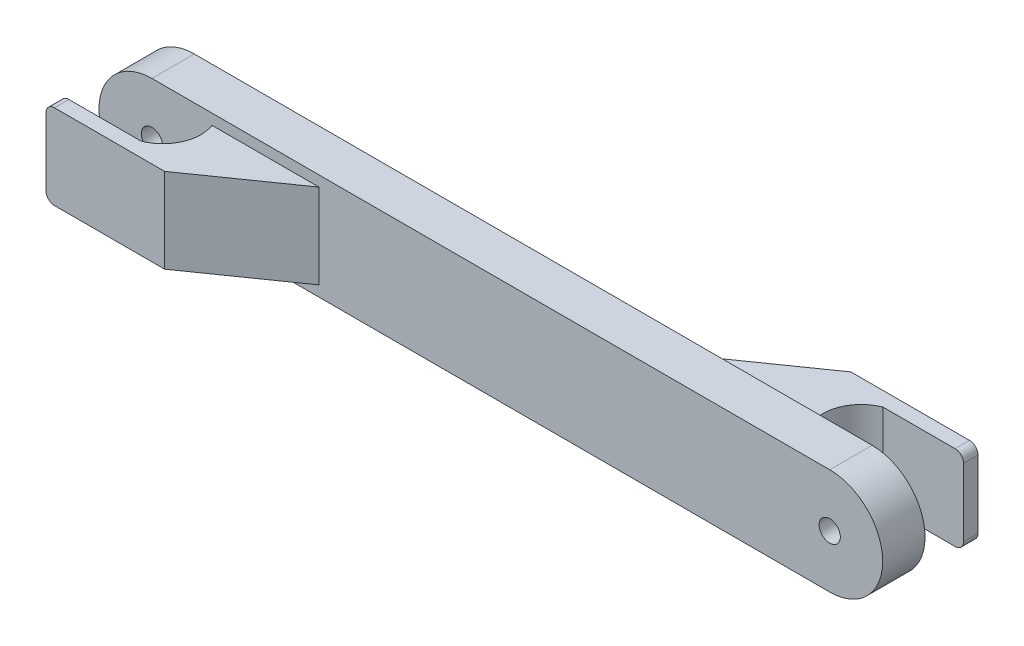
ISO-10303-21;
HEADER;
FILE_DESCRIPTION(('STEP AP214'),'2;1');
FILE_NAME('part.step','',(''),(''),'','','');
FILE_SCHEMA(('AUTOMOTIVE_DESIGN { 1 0 10303 214 1 1 1 1 }'));
ENDSEC;
DATA;
#1=APPLICATION_CONTEXT('core data for automotive mechanical design processes');
#2=APPLICATION_PROTOCOL_DEFINITION('international standard','automotive_design',2000,#1);
#3=PRODUCT_CONTEXT('',#1,'mechanical');
#4=PRODUCT('Part','Part','',(#3));
#5=PRODUCT_RELATED_PRODUCT_CATEGORY('part','',(#4));
#6=PRODUCT_DEFINITION_FORMATION('','',#4);
#7=PRODUCT_DEFINITION_CONTEXT('part definition',#1,'design');
#8=PRODUCT_DEFINITION('design','',#6,#7);
#9=PRODUCT_DEFINITION_SHAPE('','',#8);
#10=(LENGTH_UNIT() NAMED_UNIT(*) SI_UNIT(.MILLI.,.METRE.));
#11=(NAMED_UNIT(*) PLANE_ANGLE_UNIT() SI_UNIT($,.RADIAN.));
#12=(NAMED_UNIT(*) SI_UNIT($,.STERADIAN.) SOLID_ANGLE_UNIT());
#13=UNCERTAINTY_MEASURE_WITH_UNIT(LENGTH_MEASURE(1.E-05),#10,'distance_accuracy_value','');
#14=(GEOMETRIC_REPRESENTATION_CONTEXT(3) GLOBAL_UNCERTAINTY_ASSIGNED_CONTEXT((#13)) GLOBAL_UNIT_ASSIGNED_CONTEXT((#10,
#11,#12)) REPRESENTATION_CONTEXT('',''));
#15=CARTESIAN_POINT('',(0.,0.,0.));
#16=DIRECTION('',(0.,0.,1.));
#17=DIRECTION('',(1.,0.,0.));
#18=AXIS2_PLACEMENT_3D('',#15,#16,#17);
#19=CARTESIAN_POINT('',(299.870251740866,-79.0606144476608,6.35));
#20=DIRECTION('',(0.,0.,1.));
#21=DIRECTION('',(1.,0.,0.));
#22=AXIS2_PLACEMENT_3D('',#19,#20,#21);
#23=PLANE('',#22);
#24=DIRECTION('',(1.,0.,0.));
#25=VECTOR('',#24,1.);
#26=CARTESIAN_POINT('',(513.230251740866,-66.3606144476608,6.35));
#27=LINE('',#26,#25);
#28=CARTESIAN_POINT('',(450.464032212428,-66.3606144476608,6.35));
#29=VERTEX_POINT('',#28);
#30=CARTESIAN_POINT('',(485.036934777947,-66.3606144476608,6.35));
#31=VERTEX_POINT('',#30);
#32=EDGE_CURVE('E12',#29,#31,#27,.T.);
#33=ORIENTED_EDGE('',*,*,#32,.F.);
#34=DIRECTION('',(0.,-1.,0.));
#35=VECTOR('',#34,1.);
#36=CARTESIAN_POINT('',(450.464032212428,-66.3606144476608,6.35));
#37=LINE('',#36,#35);
#38=CARTESIAN_POINT('',(450.464032212428,-91.7606144476608,6.35));
#39=VERTEX_POINT('',#38);
#40=EDGE_CURVE('E101',#29,#39,#37,.T.);
#41=ORIENTED_EDGE('',*,*,#40,.T.);
#42=DIRECTION('',(-1.,0.,0.));
#43=VECTOR('',#42,1.);
#44=CARTESIAN_POINT('',(513.230251740866,-91.7606144476608,6.35));
#45=LINE('',#44,#43);
#46=CARTESIAN_POINT('',(485.036934777947,-91.7606144476608,6.35));
#47=VERTEX_POINT('',#46);
#48=EDGE_CURVE('E68',#47,#39,#45,.T.);
#49=ORIENTED_EDGE('',*,*,#48,.F.);
#50=DIRECTION('',(0.,-1.,0.));
#51=VECTOR('',#50,1.);
#52=CARTESIAN_POINT('',(485.036934777947,-61.2806144476608,6.35));
#53=LINE('',#52,#51);
#54=EDGE_CURVE('E59',#31,#47,#53,.T.);
#55=ORIENTED_EDGE('',*,*,#54,.F.);
#56=EDGE_LOOP('',(#33,#41,#49,#55));
#57=FACE_BOUND('',#56,.T.);
#58=CARTESIAN_POINT('',(299.870251740866,-79.0606144476608,6.35));
#59=DIRECTION('',(0.,0.,1.));
#60=DIRECTION('',(1.,0.,0.));
#61=AXIS2_PLACEMENT_3D('',#58,#59,#60);
#62=CIRCLE('',#61,3.17499999999997);
#63=CARTESIAN_POINT('',(303.045251740866,-79.0606144476608,6.35));
#64=VERTEX_POINT('',#63);
#65=EDGE_CURVE('E97',#64,#64,#62,.F.);
#66=ORIENTED_EDGE('',*,*,#65,.F.);
#67=EDGE_LOOP('',(#66));
#68=FACE_BOUND('',#67,.T.);
#69=CARTESIAN_POINT('',(503.070251740866,-79.0606144476608,6.35));
#70=DIRECTION('',(0.,0.,1.));
#71=DIRECTION('',(1.,0.,0.));
#72=AXIS2_PLACEMENT_3D('',#69,#70,#71);
#73=CIRCLE('',#72,3.17500000000008);
#74=CARTESIAN_POINT('',(506.245251740866,-79.0606144476608,6.35));
#75=VERTEX_POINT('',#74);
#76=EDGE_CURVE('E89',#75,#75,#73,.F.);
#77=ORIENTED_EDGE('',*,*,#76,.F.);
#78=EDGE_LOOP('',(#77));
#79=FACE_BOUND('',#78,.T.);
#80=CARTESIAN_POINT('',(503.070251740866,-79.0606144476608,6.35));
#81=DIRECTION('',(0.,0.,1.));
#82=DIRECTION('',(1.,0.,0.));
#83=AXIS2_PLACEMENT_3D('',#80,#81,#82);
#84=CIRCLE('',#83,15.875);
#85=CARTESIAN_POINT('',(503.070251740866,-63.1856144476608,6.35));
#86=VERTEX_POINT('',#85);
#87=CARTESIAN_POINT('',(503.070251740866,-94.9356144476608,6.35));
#88=VERTEX_POINT('',#87);
#89=EDGE_CURVE('E95',#86,#88,#84,.F.);
#90=ORIENTED_EDGE('',*,*,#89,.T.);
#91=DIRECTION('',(-1.,0.,0.));
#92=VECTOR('',#91,1.);
#93=CARTESIAN_POINT('',(299.870251740866,-94.9356144476608,6.35));
#94=LINE('',#93,#92);
#95=CARTESIAN_POINT('',(299.870251740866,-94.9356144476608,6.35));
#96=VERTEX_POINT('',#95);
#97=EDGE_CURVE('E94',#88,#96,#94,.T.);
#98=ORIENTED_EDGE('',*,*,#97,.T.);
#99=CARTESIAN_POINT('',(299.870251740866,-79.0606144476608,6.35));
#100=DIRECTION('',(0.,0.,1.));
#101=DIRECTION('',(1.,0.,0.));
#102=AXIS2_PLACEMENT_3D('',#99,#100,#101);
#103=CIRCLE('',#102,15.875);
#104=CARTESIAN_POINT('',(299.870251740866,-63.1856144476608,6.35));
#105=VERTEX_POINT('',#104);
#106=EDGE_CURVE('E84',#96,#105,#103,.F.);
#107=ORIENTED_EDGE('',*,*,#106,.T.);
#108=DIRECTION('',(1.,0.,0.));
#109=VECTOR('',#108,1.);
#110=CARTESIAN_POINT('',(299.870251740866,-63.1856144476608,6.35));
#111=LINE('',#110,#109);
#112=EDGE_CURVE('E87',#105,#86,#111,.T.);
#113=ORIENTED_EDGE('',*,*,#112,.T.);
#114=EDGE_LOOP('',(#90,#98,#107,#113));
#115=FACE_BOUND('',#114,.T.);
#116=ADVANCED_FACE('F52',(#57,#68,#79,#115),#23,.F.);
#117=OPEN_SHELL('',(#116));
#118=SHELL_BASED_SURFACE_MODEL('B2',(#117));
#119=CARTESIAN_POINT('',(287.170251740866,-89.2206144476608,31.75));
#120=DIRECTION('',(1.,0.,0.));
#121=DIRECTION('',(0.,0.,-1.));
#122=AXIS2_PLACEMENT_3D('',#119,#120,#121);
#123=PLANE('',#122);
#124=DIRECTION('',(0.,1.,0.));
#125=VECTOR('',#124,1.);
#126=CARTESIAN_POINT('',(287.170251740866,-107.508614447661,27.432));
#127=LINE('',#126,#125);
#128=CARTESIAN_POINT('',(287.170251740866,-89.2206144476609,27.432));
#129=VERTEX_POINT('',#128);
#130=CARTESIAN_POINT('',(287.170251740866,-68.9006144476609,27.432));
#131=VERTEX_POINT('',#130);
#132=EDGE_CURVE('E165',#129,#131,#127,.T.);
#133=ORIENTED_EDGE('',*,*,#132,.F.);
#134=DIRECTION('',(0.,0.,-1.));
#135=VECTOR('',#134,1.);
#136=CARTESIAN_POINT('',(287.170251740866,-89.2206144476608,31.75));
#137=LINE('',#136,#135);
#138=CARTESIAN_POINT('',(287.170251740866,-89.2206144476608,31.75));
#139=VERTEX_POINT('',#138);
#140=EDGE_CURVE('E328',#139,#129,#137,.T.);
#141=ORIENTED_EDGE('',*,*,#140,.F.);
#142=DIRECTION('',(0.,-1.,0.));
#143=VECTOR('',#142,1.);
#144=CARTESIAN_POINT('',(287.170251740866,-89.2206144476608,31.75));
#145=LINE('',#144,#143);
#146=CARTESIAN_POINT('',(287.170251740866,-68.9006144476609,31.75));
#147=VERTEX_POINT('',#146);
#148=EDGE_CURVE('E317',#147,#139,#145,.T.);
#149=ORIENTED_EDGE('',*,*,#148,.F.);
#150=DIRECTION('',(0.,0.,-1.));
#151=VECTOR('',#150,1.);
#152=CARTESIAN_POINT('',(287.170251740866,-68.9006144476609,31.75));
#153=LINE('',#152,#151);
#154=EDGE_CURVE('E331',#147,#131,#153,.T.);
#155=ORIENTED_EDGE('',*,*,#154,.T.);
#156=EDGE_LOOP('',(#133,#141,#149,#155));
#157=FACE_BOUND('',#156,.T.);
#158=ADVANCED_FACE('F149',(#157),#123,.F.);
#159=CARTESIAN_POINT('',(289.710251740866,-66.3606144476609,31.75));
#160=DIRECTION('',(0.,-1.,0.));
#161=DIRECTION('',(0.,0.,-1.));
#162=AXIS2_PLACEMENT_3D('',#159,#160,#161);
#163=PLANE('',#162);
#164=DIRECTION('',(1.,0.,0.));
#165=VECTOR('',#164,1.);
#166=CARTESIAN_POINT('',(287.170251740866,-66.3606144476609,27.432));
#167=LINE('',#166,#165);
#168=CARTESIAN_POINT('',(289.710251740866,-66.3606144476609,27.432));
#169=VERTEX_POINT('',#168);
#170=CARTESIAN_POINT('',(311.300251740866,-66.3606144476609,27.432));
#171=VERTEX_POINT('',#170);
#172=EDGE_CURVE('E157',#169,#171,#167,.T.);
#173=ORIENTED_EDGE('',*,*,#172,.F.);
#174=DIRECTION('',(0.,0.,-1.));
#175=VECTOR('',#174,1.);
#176=CARTESIAN_POINT('',(289.710251740866,-66.3606144476609,31.75));
#177=LINE('',#176,#175);
#178=CARTESIAN_POINT('',(289.710251740866,-66.3606144476609,31.75));
#179=VERTEX_POINT('',#178);
#180=EDGE_CURVE('E333',#179,#169,#177,.T.);
#181=ORIENTED_EDGE('',*,*,#180,.F.);
#182=DIRECTION('',(-1.,0.,0.));
#183=VECTOR('',#182,1.);
#184=CARTESIAN_POINT('',(312.570251740866,-66.3606144476609,31.75));
#185=LINE('',#184,#183);
#186=CARTESIAN_POINT('',(322.730251740866,-66.3606144476609,31.75));
#187=VERTEX_POINT('',#186);
#188=EDGE_CURVE('E321',#187,#179,#185,.T.);
#189=ORIENTED_EDGE('',*,*,#188,.F.);
#190=DIRECTION('',(0.819152044288995,0.,-0.573576436351041));
#191=VECTOR('',#190,1.);
#192=CARTESIAN_POINT('',(322.730251740866,-66.3606144476609,31.75));
#193=LINE('',#192,#191);
#194=CARTESIAN_POINT('',(349.936471269304,-66.3606144476609,12.7));
#195=VERTEX_POINT('',#194);
#196=EDGE_CURVE('E295',#187,#195,#193,.T.);
#197=ORIENTED_EDGE('',*,*,#196,.T.);
#198=DIRECTION('',(-1.,0.,0.));
#199=VECTOR('',#198,1.);
#200=CARTESIAN_POINT('',(289.710251740866,-66.3606144476609,12.7));
#201=LINE('',#200,#199);
#202=CARTESIAN_POINT('',(317.904251740866,-66.3606144476609,12.7));
#203=VERTEX_POINT('',#202);
#204=EDGE_CURVE('E318',#195,#203,#201,.T.);
#205=ORIENTED_EDGE('',*,*,#204,.T.);
#206=CARTESIAN_POINT('',(307.218041577106,-66.3606144476609,16.7558368231421));
#207=DIRECTION('',(0.,1.,0.));
#208=DIRECTION('',(0.,0.,-1.));
#209=AXIS2_PLACEMENT_3D('',#206,#207,#208);
#210=CIRCLE('',#209,11.43);
#211=EDGE_CURVE('E509',#171,#203,#210,.T.);
#212=ORIENTED_EDGE('',*,*,#211,.F.);
#213=EDGE_LOOP('',(#173,#181,#189,#197,#205,#212));
#214=FACE_BOUND('',#213,.T.);
#215=ADVANCED_FACE('F479',(#214),#163,.F.);
#216=CARTESIAN_POINT('',(299.870251740866,-79.0606144476608,0.));
#217=DIRECTION('',(0.,0.,1.));
#218=DIRECTION('',(1.,0.,0.));
#219=AXIS2_PLACEMENT_3D('',#216,#217,#218);
#220=PLANE('',#219);
#221=CARTESIAN_POINT('',(503.070251740866,-79.0606144476608,0.));
#222=DIRECTION('',(0.,0.,1.));
#223=DIRECTION('',(1.,0.,0.));
#224=AXIS2_PLACEMENT_3D('',#221,#222,#223);
#225=CIRCLE('',#224,3.17500000000008);
#226=CARTESIAN_POINT('',(506.245251740866,-79.0606144476608,0.));
#227=VERTEX_POINT('',#226);
#228=EDGE_CURVE('E354',#227,#227,#225,.T.);
#229=ORIENTED_EDGE('',*,*,#228,.T.);
#230=EDGE_LOOP('',(#229));
#231=FACE_BOUND('',#230,.T.);
#232=CARTESIAN_POINT('',(299.870251740866,-79.0606144476608,0.));
#233=DIRECTION('',(0.,0.,1.));
#234=DIRECTION('',(1.,0.,0.));
#235=AXIS2_PLACEMENT_3D('',#232,#233,#234);
#236=CIRCLE('',#235,15.875);
#237=CARTESIAN_POINT('',(299.870251740866,-63.1856144476608,0.));
#238=VERTEX_POINT('',#237);
#239=CARTESIAN_POINT('',(299.870251740866,-94.9356144476608,0.));
#240=VERTEX_POINT('',#239);
#241=EDGE_CURVE('E409',#238,#240,#236,.T.);
#242=ORIENTED_EDGE('',*,*,#241,.F.);
#243=DIRECTION('',(-1.,0.,0.));
#244=VECTOR('',#243,1.);
#245=CARTESIAN_POINT('',(299.870251740866,-63.1856144476608,0.));
#246=LINE('',#245,#244);
#247=CARTESIAN_POINT('',(503.070251740866,-63.1856144476608,0.));
#248=VERTEX_POINT('',#247);
#249=EDGE_CURVE('E413',#248,#238,#246,.T.);
#250=ORIENTED_EDGE('',*,*,#249,.F.);
#251=CARTESIAN_POINT('',(503.070251740866,-79.0606144476608,0.));
#252=DIRECTION('',(0.,0.,1.));
#253=DIRECTION('',(1.,0.,0.));
#254=AXIS2_PLACEMENT_3D('',#251,#252,#253);
#255=CIRCLE('',#254,15.875);
#256=CARTESIAN_POINT('',(503.070251740866,-94.9356144476608,0.));
#257=VERTEX_POINT('',#256);
#258=EDGE_CURVE('E425',#257,#248,#255,.T.);
#259=ORIENTED_EDGE('',*,*,#258,.F.);
#260=DIRECTION('',(1.,0.,0.));
#261=VECTOR('',#260,1.);
#262=CARTESIAN_POINT('',(299.870251740866,-94.9356144476608,0.));
#263=LINE('',#262,#261);
#264=EDGE_CURVE('E422',#240,#257,#263,.T.);
#265=ORIENTED_EDGE('',*,*,#264,.F.);
#266=EDGE_LOOP('',(#242,#250,#259,#265));
#267=FACE_BOUND('',#266,.T.);
#268=CARTESIAN_POINT('',(299.870251740866,-79.0606144476608,0.));
#269=DIRECTION('',(0.,0.,1.));
#270=DIRECTION('',(1.,0.,0.));
#271=AXIS2_PLACEMENT_3D('',#268,#269,#270);
#272=CIRCLE('',#271,3.17499999999997);
#273=CARTESIAN_POINT('',(303.045251740866,-79.0606144476608,0.));
#274=VERTEX_POINT('',#273);
#275=EDGE_CURVE('E402',#274,#274,#272,.T.);
#276=ORIENTED_EDGE('',*,*,#275,.T.);
#277=EDGE_LOOP('',(#276));
#278=FACE_BOUND('',#277,.T.);
#279=DIRECTION('',(0.,-1.,0.));
#280=VECTOR('',#279,1.);
#281=CARTESIAN_POINT('',(450.464032212428,-66.3606144476608,0.));
#282=LINE('',#281,#280);
#283=CARTESIAN_POINT('',(450.464032212428,-66.3606144476608,0.));
#284=VERTEX_POINT('',#283);
#285=CARTESIAN_POINT('',(450.464032212428,-91.7606144476608,0.));
#286=VERTEX_POINT('',#285);
#287=EDGE_CURVE('E338',#284,#286,#282,.T.);
#288=ORIENTED_EDGE('',*,*,#287,.T.);
#289=DIRECTION('',(-1.,0.,0.));
#290=VECTOR('',#289,1.);
#291=CARTESIAN_POINT('',(513.230251740866,-91.7606144476608,0.));
#292=LINE('',#291,#290);
#293=CARTESIAN_POINT('',(485.036934777947,-91.7606144476608,0.));
#294=VERTEX_POINT('',#293);
#295=EDGE_CURVE('E171',#294,#286,#292,.T.);
#296=ORIENTED_EDGE('',*,*,#295,.F.);
#297=DIRECTION('',(0.,-1.,0.));
#298=VECTOR('',#297,1.);
#299=CARTESIAN_POINT('',(485.036934777947,-61.2806144476608,0.));
#300=LINE('',#299,#298);
#301=CARTESIAN_POINT('',(485.036934777947,-66.3606144476608,0.));
#302=VERTEX_POINT('',#301);
#303=EDGE_CURVE('E347',#302,#294,#300,.T.);
#304=ORIENTED_EDGE('',*,*,#303,.F.);
#305=DIRECTION('',(1.,0.,0.));
#306=VECTOR('',#305,1.);
#307=CARTESIAN_POINT('',(513.230251740866,-66.3606144476608,0.));
#308=LINE('',#307,#306);
#309=EDGE_CURVE('E366',#284,#302,#308,.T.);
#310=ORIENTED_EDGE('',*,*,#309,.F.);
#311=EDGE_LOOP('',(#288,#296,#304,#310));
#312=FACE_BOUND('',#311,.T.);
#313=ADVANCED_FACE('F465',(#231,#267,#278,#312),#220,.F.);
#314=CARTESIAN_POINT('',(513.230251740866,-91.7606144476608,-19.05));
#315=DIRECTION('',(0.,1.,0.));
#316=DIRECTION('',(0.,0.,1.));
#317=AXIS2_PLACEMENT_3D('',#314,#315,#316);
#318=PLANE('',#317);
#319=CARTESIAN_POINT('',(495.705324468243,-91.7606144476608,-4.06507272737682));
#320=DIRECTION('',(0.,-1.,0.));
#321=DIRECTION('',(0.,0.,1.));
#322=AXIS2_PLACEMENT_3D('',#319,#320,#321);
#323=CIRCLE('',#322,11.4166262469649);
#324=CARTESIAN_POINT('',(491.640251740866,-91.7606144476608,-14.7334624176732));
#325=VERTEX_POINT('',#324);
#326=EDGE_CURVE('E344',#294,#325,#323,.T.);
#327=ORIENTED_EDGE('',*,*,#326,.F.);
#328=ORIENTED_EDGE('',*,*,#295,.T.);
#329=DIRECTION('',(0.819152044288999,0.,-0.573576436351036));
#330=VECTOR('',#329,1.);
#331=CARTESIAN_POINT('',(477.670251740866,-91.7606144476608,-19.05));
#332=LINE('',#331,#330);
#333=CARTESIAN_POINT('',(477.670251740866,-91.7606144476608,-19.05));
#334=VERTEX_POINT('',#333);
#335=EDGE_CURVE('E340',#286,#334,#332,.T.);
#336=ORIENTED_EDGE('',*,*,#335,.T.);
#337=DIRECTION('',(-1.,0.,0.));
#338=VECTOR('',#337,1.);
#339=CARTESIAN_POINT('',(513.230251740866,-91.7606144476608,-19.05));
#340=LINE('',#339,#338);
#341=CARTESIAN_POINT('',(513.230251740866,-91.7606144476608,-19.05));
#342=VERTEX_POINT('',#341);
#343=EDGE_CURVE('E369',#342,#334,#340,.T.);
#344=ORIENTED_EDGE('',*,*,#343,.F.);
#345=DIRECTION('',(0.,0.,1.));
#346=VECTOR('',#345,1.);
#347=CARTESIAN_POINT('',(513.230251740866,-91.7606144476608,-19.05));
#348=LINE('',#347,#346);
#349=CARTESIAN_POINT('',(513.230251740866,-91.7606144476608,-14.7334624176732));
#350=VERTEX_POINT('',#349);
#351=EDGE_CURVE('E394',#342,#350,#348,.T.);
#352=ORIENTED_EDGE('',*,*,#351,.T.);
#353=DIRECTION('',(1.,0.,0.));
#354=VECTOR('',#353,1.);
#355=CARTESIAN_POINT('',(491.640251740866,-91.7606144476608,-14.7334624176732));
#356=LINE('',#355,#354);
#357=EDGE_CURVE('E350',#325,#350,#356,.T.);
#358=ORIENTED_EDGE('',*,*,#357,.F.);
#359=EDGE_LOOP('',(#327,#328,#336,#344,#352,#358));
#360=FACE_BOUND('',#359,.T.);
#361=ADVANCED_FACE('F443',(#360),#318,.F.);
#362=CARTESIAN_POINT('',(299.870251740866,-79.0606144476608,12.7));
#363=DIRECTION('',(0.,0.,1.));
#364=DIRECTION('',(1.,0.,0.));
#365=AXIS2_PLACEMENT_3D('',#362,#363,#364);
#366=PLANE('',#365);
#367=ORIENTED_EDGE('',*,*,#204,.F.);
#368=DIRECTION('',(0.,1.,0.));
#369=VECTOR('',#368,1.);
#370=CARTESIAN_POINT('',(349.936471269304,-91.7606144476608,12.7));
#371=LINE('',#370,#369);
#372=CARTESIAN_POINT('',(349.936471269304,-91.7606144476608,12.7));
#373=VERTEX_POINT('',#372);
#374=EDGE_CURVE('E307',#373,#195,#371,.T.);
#375=ORIENTED_EDGE('',*,*,#374,.F.);
#376=DIRECTION('',(1.,0.,0.));
#377=VECTOR('',#376,1.);
#378=CARTESIAN_POINT('',(310.030251740866,-91.7606144476609,12.7));
#379=LINE('',#378,#377);
#380=CARTESIAN_POINT('',(317.904251740866,-91.7606144476609,12.7));
#381=VERTEX_POINT('',#380);
#382=EDGE_CURVE('E308',#381,#373,#379,.T.);
#383=ORIENTED_EDGE('',*,*,#382,.F.);
#384=DIRECTION('',(0.,1.,0.));
#385=VECTOR('',#384,1.);
#386=CARTESIAN_POINT('',(317.904251740866,-107.508614447661,12.7));
#387=LINE('',#386,#385);
#388=EDGE_CURVE('E516',#381,#203,#387,.T.);
#389=ORIENTED_EDGE('',*,*,#388,.T.);
#390=EDGE_LOOP('',(#367,#375,#383,#389));
#391=FACE_BOUND('',#390,.T.);
#392=CARTESIAN_POINT('',(299.870251740866,-79.0606144476608,12.7));
#393=DIRECTION('',(0.,0.,1.));
#394=DIRECTION('',(1.,0.,0.));
#395=AXIS2_PLACEMENT_3D('',#392,#393,#394);
#396=CIRCLE('',#395,15.875);
#397=CARTESIAN_POINT('',(299.870251740866,-63.1856144476608,12.7));
#398=VERTEX_POINT('',#397);
#399=CARTESIAN_POINT('',(299.870251740866,-94.9356144476608,12.7));
#400=VERTEX_POINT('',#399);
#401=EDGE_CURVE('E407',#398,#400,#396,.T.);
#402=ORIENTED_EDGE('',*,*,#401,.T.);
#403=DIRECTION('',(1.,0.,0.));
#404=VECTOR('',#403,1.);
#405=CARTESIAN_POINT('',(299.870251740866,-94.9356144476608,12.7));
#406=LINE('',#405,#404);
#407=CARTESIAN_POINT('',(503.070251740866,-94.9356144476608,12.7));
#408=VERTEX_POINT('',#407);
#409=EDGE_CURVE('E415',#400,#408,#406,.T.);
#410=ORIENTED_EDGE('',*,*,#409,.T.);
#411=CARTESIAN_POINT('',(503.070251740866,-79.0606144476608,12.7));
#412=DIRECTION('',(0.,0.,1.));
#413=DIRECTION('',(1.,0.,0.));
#414=AXIS2_PLACEMENT_3D('',#411,#412,#413);
#415=CIRCLE('',#414,15.875);
#416=CARTESIAN_POINT('',(503.070251740866,-63.1856144476608,12.7));
#417=VERTEX_POINT('',#416);
#418=EDGE_CURVE('E414',#408,#417,#415,.T.);
#419=ORIENTED_EDGE('',*,*,#418,.T.);
#420=DIRECTION('',(-1.,0.,0.));
#421=VECTOR('',#420,1.);
#422=CARTESIAN_POINT('',(299.870251740866,-63.1856144476608,12.7));
#423=LINE('',#422,#421);
#424=EDGE_CURVE('E417',#417,#398,#423,.T.);
#425=ORIENTED_EDGE('',*,*,#424,.T.);
#426=EDGE_LOOP('',(#402,#410,#419,#425));
#427=FACE_BOUND('',#426,.T.);
#428=CARTESIAN_POINT('',(503.070251740866,-79.0606144476608,12.7));
#429=DIRECTION('',(0.,0.,1.));
#430=DIRECTION('',(1.,0.,0.));
#431=AXIS2_PLACEMENT_3D('',#428,#429,#430);
#432=CIRCLE('',#431,3.17500000000008);
#433=CARTESIAN_POINT('',(506.245251740866,-79.0606144476608,12.7));
#434=VERTEX_POINT('',#433);
#435=EDGE_CURVE('E399',#434,#434,#432,.T.);
#436=ORIENTED_EDGE('',*,*,#435,.F.);
#437=EDGE_LOOP('',(#436));
#438=FACE_BOUND('',#437,.T.);
#439=CARTESIAN_POINT('',(299.870251740866,-79.0606144476608,12.7));
#440=DIRECTION('',(0.,0.,1.));
#441=DIRECTION('',(1.,0.,0.));
#442=AXIS2_PLACEMENT_3D('',#439,#440,#441);
#443=CIRCLE('',#442,3.17499999999997);
#444=CARTESIAN_POINT('',(303.045251740866,-79.0606144476608,12.7));
#445=VERTEX_POINT('',#444);
#446=EDGE_CURVE('E324',#445,#445,#443,.T.);
#447=ORIENTED_EDGE('',*,*,#446,.F.);
#448=EDGE_LOOP('',(#447));
#449=FACE_BOUND('',#448,.T.);
#450=ADVANCED_FACE('F534',(#391,#427,#438,#449),#366,.T.);
#451=CARTESIAN_POINT('',(299.870251740866,-79.0606144476608,12.7));
#452=DIRECTION('',(0.,0.,-1.));
#453=DIRECTION('',(-1.,0.,0.));
#454=AXIS2_PLACEMENT_3D('',#451,#452,#453);
#455=CYLINDRICAL_SURFACE('',#454,15.875);
#456=ORIENTED_EDGE('',*,*,#241,.T.);
#457=DIRECTION('',(0.,0.,-1.));
#458=VECTOR('',#457,1.);
#459=CARTESIAN_POINT('',(299.870251740866,-94.9356144476608,12.7));
#460=LINE('',#459,#458);
#461=EDGE_CURVE('E381',#400,#240,#460,.T.);
#462=ORIENTED_EDGE('',*,*,#461,.F.);
#463=ORIENTED_EDGE('',*,*,#401,.F.);
#464=DIRECTION('',(0.,0.,-1.));
#465=VECTOR('',#464,1.);
#466=CARTESIAN_POINT('',(299.870251740866,-63.1856144476608,12.7));
#467=LINE('',#466,#465);
#468=EDGE_CURVE('E418',#398,#238,#467,.T.);
#469=ORIENTED_EDGE('',*,*,#468,.T.);
#470=EDGE_LOOP('',(#456,#462,#463,#469));
#471=FACE_BOUND('',#470,.T.);
#472=ADVANCED_FACE('F151',(#471),#455,.T.);
#473=CARTESIAN_POINT('',(299.870251740866,-94.9356144476608,12.7));
#474=DIRECTION('',(0.,1.,0.));
#475=DIRECTION('',(0.,0.,1.));
#476=AXIS2_PLACEMENT_3D('',#473,#474,#475);
#477=PLANE('',#476);
#478=ORIENTED_EDGE('',*,*,#264,.T.);
#479=DIRECTION('',(0.,0.,-1.));
#480=VECTOR('',#479,1.);
#481=CARTESIAN_POINT('',(503.070251740866,-94.9356144476608,12.7));
#482=LINE('',#481,#480);
#483=EDGE_CURVE('E435',#408,#257,#482,.T.);
#484=ORIENTED_EDGE('',*,*,#483,.F.);
#485=ORIENTED_EDGE('',*,*,#409,.F.);
#486=ORIENTED_EDGE('',*,*,#461,.T.);
#487=EDGE_LOOP('',(#478,#484,#485,#486));
#488=FACE_BOUND('',#487,.T.);
#489=ADVANCED_FACE('F570',(#488),#477,.F.);
#490=CARTESIAN_POINT('',(503.070251740866,-79.0606144476608,12.7));
#491=DIRECTION('',(0.,0.,-1.));
#492=DIRECTION('',(-1.,0.,0.));
#493=AXIS2_PLACEMENT_3D('',#490,#491,#492);
#494=CYLINDRICAL_SURFACE('',#493,15.875);
#495=ORIENTED_EDGE('',*,*,#258,.T.);
#496=DIRECTION('',(0.,0.,-1.));
#497=VECTOR('',#496,1.);
#498=CARTESIAN_POINT('',(503.070251740866,-63.1856144476608,12.7));
#499=LINE('',#498,#497);
#500=EDGE_CURVE('E429',#417,#248,#499,.T.);
#501=ORIENTED_EDGE('',*,*,#500,.F.);
#502=ORIENTED_EDGE('',*,*,#418,.F.);
#503=ORIENTED_EDGE('',*,*,#483,.T.);
#504=EDGE_LOOP('',(#495,#501,#502,#503));
#505=FACE_BOUND('',#504,.T.);
#506=ADVANCED_FACE('F562',(#505),#494,.T.);
#507=CARTESIAN_POINT('',(299.870251740866,-63.1856144476608,12.7));
#508=DIRECTION('',(0.,-1.,0.));
#509=DIRECTION('',(0.,0.,-1.));
#510=AXIS2_PLACEMENT_3D('',#507,#508,#509);
#511=PLANE('',#510);
#512=ORIENTED_EDGE('',*,*,#249,.T.);
#513=ORIENTED_EDGE('',*,*,#468,.F.);
#514=ORIENTED_EDGE('',*,*,#424,.F.);
#515=ORIENTED_EDGE('',*,*,#500,.T.);
#516=EDGE_LOOP('',(#512,#513,#514,#515));
#517=FACE_BOUND('',#516,.T.);
#518=ADVANCED_FACE('F548',(#517),#511,.F.);
#519=CARTESIAN_POINT('',(299.870251740866,-79.0606144476608,12.7));
#520=DIRECTION('',(0.,0.,-1.));
#521=DIRECTION('',(-1.,0.,0.));
#522=AXIS2_PLACEMENT_3D('',#519,#520,#521);
#523=CYLINDRICAL_SURFACE('',#522,3.17499999999997);
#524=ORIENTED_EDGE('',*,*,#446,.T.);
#525=EDGE_LOOP('',(#524));
#526=FACE_BOUND('',#525,.T.);
#527=ORIENTED_EDGE('',*,*,#275,.F.);
#528=EDGE_LOOP('',(#527));
#529=FACE_BOUND('',#528,.T.);
#530=ADVANCED_FACE('F544',(#526,#529),#523,.F.);
#531=CARTESIAN_POINT('',(503.070251740866,-79.0606144476608,12.7));
#532=DIRECTION('',(0.,0.,-1.));
#533=DIRECTION('',(-1.,0.,0.));
#534=AXIS2_PLACEMENT_3D('',#531,#532,#533);
#535=CYLINDRICAL_SURFACE('',#534,3.17500000000008);
#536=ORIENTED_EDGE('',*,*,#435,.T.);
#537=EDGE_LOOP('',(#536));
#538=FACE_BOUND('',#537,.T.);
#539=ORIENTED_EDGE('',*,*,#228,.F.);
#540=EDGE_LOOP('',(#539));
#541=FACE_BOUND('',#540,.T.);
#542=ADVANCED_FACE('F549',(#538,#541),#535,.F.);
#543=CARTESIAN_POINT('',(513.230251740866,-89.2206144476608,-19.05));
#544=DIRECTION('',(0.,0.,1.));
#545=DIRECTION('',(1.,0.,0.));
#546=AXIS2_PLACEMENT_3D('',#543,#544,#545);
#547=PLANE('',#546);
#548=CARTESIAN_POINT('',(513.230251740866,-89.2206144476608,-19.05));
#549=DIRECTION('',(0.,0.,-1.));
#550=DIRECTION('',(1.,0.,0.));
#551=AXIS2_PLACEMENT_3D('',#548,#549,#550);
#552=CIRCLE('',#551,2.53999999999999);
#553=CARTESIAN_POINT('',(515.770251740866,-89.2206144476608,-19.05));
#554=VERTEX_POINT('',#553);
#555=EDGE_CURVE('E370',#554,#342,#552,.T.);
#556=ORIENTED_EDGE('',*,*,#555,.T.);
#557=ORIENTED_EDGE('',*,*,#343,.T.);
#558=DIRECTION('',(0.,1.,0.));
#559=VECTOR('',#558,1.);
#560=CARTESIAN_POINT('',(477.670251740866,-66.3606144476608,-19.05));
#561=LINE('',#560,#559);
#562=CARTESIAN_POINT('',(477.670251740866,-66.3606144476608,-19.05));
#563=VERTEX_POINT('',#562);
#564=EDGE_CURVE('E373',#334,#563,#561,.T.);
#565=ORIENTED_EDGE('',*,*,#564,.T.);
#566=DIRECTION('',(1.,0.,0.));
#567=VECTOR('',#566,1.);
#568=CARTESIAN_POINT('',(513.230251740866,-66.3606144476608,-19.05));
#569=LINE('',#568,#567);
#570=CARTESIAN_POINT('',(513.230251740866,-66.3606144476608,-19.05));
#571=VERTEX_POINT('',#570);
#572=EDGE_CURVE('E376',#563,#571,#569,.T.);
#573=ORIENTED_EDGE('',*,*,#572,.T.);
#574=CARTESIAN_POINT('',(513.230251740866,-68.9006144476608,-19.05));
#575=DIRECTION('',(0.,0.,-1.));
#576=DIRECTION('',(1.,0.,0.));
#577=AXIS2_PLACEMENT_3D('',#574,#575,#576);
#578=CIRCLE('',#577,2.53999999999999);
#579=CARTESIAN_POINT('',(515.770251740866,-68.9006144476609,-19.05));
#580=VERTEX_POINT('',#579);
#581=EDGE_CURVE('E377',#571,#580,#578,.T.);
#582=ORIENTED_EDGE('',*,*,#581,.T.);
#583=DIRECTION('',(0.,-1.,0.));
#584=VECTOR('',#583,1.);
#585=CARTESIAN_POINT('',(515.770251740866,-89.2206144476608,-19.05));
#586=LINE('',#585,#584);
#587=EDGE_CURVE('E379',#580,#554,#586,.T.);
#588=ORIENTED_EDGE('',*,*,#587,.T.);
#589=EDGE_LOOP('',(#556,#557,#565,#573,#582,#588));
#590=FACE_BOUND('',#589,.T.);
#591=ADVANCED_FACE('F447',(#590),#547,.F.);
#592=CARTESIAN_POINT('',(515.770251740866,-89.2206144476608,-19.05));
#593=DIRECTION('',(-1.,0.,0.));
#594=DIRECTION('',(0.,0.,1.));
#595=AXIS2_PLACEMENT_3D('',#592,#593,#594);
#596=PLANE('',#595);
#597=DIRECTION('',(0.,0.,1.));
#598=VECTOR('',#597,1.);
#599=CARTESIAN_POINT('',(515.770251740866,-68.9006144476609,-19.05));
#600=LINE('',#599,#598);
#601=CARTESIAN_POINT('',(515.770251740866,-68.9006144476608,-14.7334624176732));
#602=VERTEX_POINT('',#601);
#603=EDGE_CURVE('E389',#580,#602,#600,.T.);
#604=ORIENTED_EDGE('',*,*,#603,.T.);
#605=DIRECTION('',(0.,-1.,0.));
#606=VECTOR('',#605,1.);
#607=CARTESIAN_POINT('',(515.770251740866,-61.2806144476608,-14.7334624176732));
#608=LINE('',#607,#606);
#609=CARTESIAN_POINT('',(515.770251740866,-89.2206144476608,-14.7334624176732));
#610=VERTEX_POINT('',#609);
#611=EDGE_CURVE('E349',#602,#610,#608,.T.);
#612=ORIENTED_EDGE('',*,*,#611,.T.);
#613=DIRECTION('',(0.,0.,1.));
#614=VECTOR('',#613,1.);
#615=CARTESIAN_POINT('',(515.770251740866,-89.2206144476608,-19.05));
#616=LINE('',#615,#614);
#617=EDGE_CURVE('E385',#554,#610,#616,.T.);
#618=ORIENTED_EDGE('',*,*,#617,.F.);
#619=ORIENTED_EDGE('',*,*,#587,.F.);
#620=EDGE_LOOP('',(#604,#612,#618,#619));
#621=FACE_BOUND('',#620,.T.);
#622=ADVANCED_FACE('F453',(#621),#596,.F.);
#623=CARTESIAN_POINT('',(513.230251740866,-68.9006144476608,-19.05));
#624=DIRECTION('',(0.,0.,1.));
#625=DIRECTION('',(1.,0.,0.));
#626=AXIS2_PLACEMENT_3D('',#623,#624,#625);
#627=CYLINDRICAL_SURFACE('',#626,2.53999999999999);
#628=DIRECTION('',(0.,0.,1.));
#629=VECTOR('',#628,1.);
#630=CARTESIAN_POINT('',(513.230251740866,-66.3606144476608,-19.05));
#631=LINE('',#630,#629);
#632=CARTESIAN_POINT('',(513.230251740866,-66.3606144476608,-14.7334624176732));
#633=VERTEX_POINT('',#632);
#634=EDGE_CURVE('E395',#571,#633,#631,.T.);
#635=ORIENTED_EDGE('',*,*,#634,.T.);
#636=CARTESIAN_POINT('',(513.230251740866,-68.9006144476608,-14.7334624176732));
#637=DIRECTION('',(0.,0.,-1.));
#638=DIRECTION('',(-1.,0.,0.));
#639=AXIS2_PLACEMENT_3D('',#636,#637,#638);
#640=CIRCLE('',#639,2.53999999999999);
#641=EDGE_CURVE('E359',#633,#602,#640,.T.);
#642=ORIENTED_EDGE('',*,*,#641,.T.);
#643=ORIENTED_EDGE('',*,*,#603,.F.);
#644=ORIENTED_EDGE('',*,*,#581,.F.);
#645=EDGE_LOOP('',(#635,#642,#643,#644));
#646=FACE_BOUND('',#645,.T.);
#647=ADVANCED_FACE('F454',(#646),#627,.T.);
#648=CARTESIAN_POINT('',(513.230251740866,-66.3606144476608,-19.05));
#649=DIRECTION('',(0.,-1.,0.));
#650=DIRECTION('',(0.,0.,-1.));
#651=AXIS2_PLACEMENT_3D('',#648,#649,#650);
#652=PLANE('',#651);
#653=CARTESIAN_POINT('',(495.705324468243,-66.3606144476608,-4.06507272737682));
#654=DIRECTION('',(0.,-1.,0.));
#655=DIRECTION('',(0.,0.,-1.));
#656=AXIS2_PLACEMENT_3D('',#653,#654,#655);
#657=CIRCLE('',#656,11.4166262469649);
#658=CARTESIAN_POINT('',(491.640251740866,-66.3606144476608,-14.7334624176732));
#659=VERTEX_POINT('',#658);
#660=EDGE_CURVE('E361',#302,#659,#657,.T.);
#661=ORIENTED_EDGE('',*,*,#660,.T.);
#662=DIRECTION('',(1.,0.,0.));
#663=VECTOR('',#662,1.);
#664=CARTESIAN_POINT('',(513.230251740866,-66.3606144476608,-14.7334624176732));
#665=LINE('',#664,#663);
#666=EDGE_CURVE('E357',#659,#633,#665,.T.);
#667=ORIENTED_EDGE('',*,*,#666,.T.);
#668=ORIENTED_EDGE('',*,*,#634,.F.);
#669=ORIENTED_EDGE('',*,*,#572,.F.);
#670=DIRECTION('',(0.819152044288999,0.,-0.573576436351036));
#671=VECTOR('',#670,1.);
#672=CARTESIAN_POINT('',(477.670251740866,-66.3606144476608,-19.05));
#673=LINE('',#672,#671);
#674=EDGE_CURVE('E336',#284,#563,#673,.T.);
#675=ORIENTED_EDGE('',*,*,#674,.F.);
#676=ORIENTED_EDGE('',*,*,#309,.T.);
#677=EDGE_LOOP('',(#661,#667,#668,#669,#675,#676));
#678=FACE_BOUND('',#677,.T.);
#679=ADVANCED_FACE('F458',(#678),#652,.F.);
#680=CARTESIAN_POINT('',(513.230251740866,-89.2206144476608,-19.05));
#681=DIRECTION('',(0.,0.,1.));
#682=DIRECTION('',(1.,0.,0.));
#683=AXIS2_PLACEMENT_3D('',#680,#681,#682);
#684=CYLINDRICAL_SURFACE('',#683,2.53999999999999);
#685=ORIENTED_EDGE('',*,*,#617,.T.);
#686=CARTESIAN_POINT('',(513.230251740866,-89.2206144476608,-14.7334624176732));
#687=DIRECTION('',(0.,0.,-1.));
#688=DIRECTION('',(-1.,0.,0.));
#689=AXIS2_PLACEMENT_3D('',#686,#687,#688);
#690=CIRCLE('',#689,2.53999999999999);
#691=EDGE_CURVE('E326',#610,#350,#690,.T.);
#692=ORIENTED_EDGE('',*,*,#691,.T.);
#693=ORIENTED_EDGE('',*,*,#351,.F.);
#694=ORIENTED_EDGE('',*,*,#555,.F.);
#695=EDGE_LOOP('',(#685,#692,#693,#694));
#696=FACE_BOUND('',#695,.T.);
#697=ADVANCED_FACE('F437',(#696),#684,.T.);
#698=CARTESIAN_POINT('',(495.705324468243,-61.2806144476608,-4.06507272737682));
#699=DIRECTION('',(0.,-1.,0.));
#700=DIRECTION('',(0.,0.,-1.));
#701=AXIS2_PLACEMENT_3D('',#698,#699,#700);
#702=CYLINDRICAL_SURFACE('',#701,11.4166262469649);
#703=ORIENTED_EDGE('',*,*,#303,.T.);
#704=ORIENTED_EDGE('',*,*,#326,.T.);
#705=DIRECTION('',(0.,-1.,0.));
#706=VECTOR('',#705,1.);
#707=CARTESIAN_POINT('',(491.640251740866,-61.2806144476608,-14.7334624176732));
#708=LINE('',#707,#706);
#709=EDGE_CURVE('E353',#659,#325,#708,.T.);
#710=ORIENTED_EDGE('',*,*,#709,.F.);
#711=ORIENTED_EDGE('',*,*,#660,.F.);
#712=EDGE_LOOP('',(#703,#704,#710,#711));
#713=FACE_BOUND('',#712,.T.);
#714=ADVANCED_FACE('F462',(#713),#702,.F.);
#715=CARTESIAN_POINT('',(491.640251740866,-61.2806144476608,-14.7334624176732));
#716=DIRECTION('',(0.,0.,-1.));
#717=DIRECTION('',(-1.,0.,0.));
#718=AXIS2_PLACEMENT_3D('',#715,#716,#717);
#719=PLANE('',#718);
#720=ORIENTED_EDGE('',*,*,#666,.F.);
#721=ORIENTED_EDGE('',*,*,#709,.T.);
#722=ORIENTED_EDGE('',*,*,#357,.T.);
#723=ORIENTED_EDGE('',*,*,#691,.F.);
#724=ORIENTED_EDGE('',*,*,#611,.F.);
#725=ORIENTED_EDGE('',*,*,#641,.F.);
#726=EDGE_LOOP('',(#720,#721,#722,#723,#724,#725));
#727=FACE_BOUND('',#726,.T.);
#728=ADVANCED_FACE('F455',(#727),#719,.F.);
#729=CARTESIAN_POINT('',(477.670251740866,-66.3606144476608,-19.05));
#730=DIRECTION('',(-0.573576436351036,0.,-0.819152044288999));
#731=DIRECTION('',(-0.819152044288999,0.,0.573576436351036));
#732=AXIS2_PLACEMENT_3D('',#729,#730,#731);
#733=PLANE('',#732);
#734=ORIENTED_EDGE('',*,*,#335,.F.);
#735=ORIENTED_EDGE('',*,*,#287,.F.);
#736=ORIENTED_EDGE('',*,*,#674,.T.);
#737=ORIENTED_EDGE('',*,*,#564,.F.);
#738=EDGE_LOOP('',(#734,#735,#736,#737));
#739=FACE_BOUND('',#738,.T.);
#740=ADVANCED_FACE('F466',(#739),#733,.T.);
#741=CARTESIAN_POINT('',(289.710251740866,-89.2206144476609,31.75));
#742=DIRECTION('',(0.,0.,-1.));
#743=DIRECTION('',(-1.,0.,0.));
#744=AXIS2_PLACEMENT_3D('',#741,#742,#743);
#745=PLANE('',#744);
#746=ORIENTED_EDGE('',*,*,#188,.T.);
#747=CARTESIAN_POINT('',(289.710251740866,-68.9006144476609,31.75));
#748=DIRECTION('',(0.,0.,1.));
#749=DIRECTION('',(-1.,0.,0.));
#750=AXIS2_PLACEMENT_3D('',#747,#748,#749);
#751=CIRCLE('',#750,2.53999999999999);
#752=EDGE_CURVE('E506',#179,#147,#751,.T.);
#753=ORIENTED_EDGE('',*,*,#752,.T.);
#754=ORIENTED_EDGE('',*,*,#148,.T.);
#755=CARTESIAN_POINT('',(289.710251740866,-89.2206144476609,31.75));
#756=DIRECTION('',(0.,0.,1.));
#757=DIRECTION('',(-1.,0.,0.));
#758=AXIS2_PLACEMENT_3D('',#755,#756,#757);
#759=CIRCLE('',#758,2.53999999999999);
#760=CARTESIAN_POINT('',(289.710251740866,-91.7606144476608,31.75));
#761=VERTEX_POINT('',#760);
#762=EDGE_CURVE('E312',#139,#761,#759,.T.);
#763=ORIENTED_EDGE('',*,*,#762,.T.);
#764=DIRECTION('',(1.,0.,0.));
#765=VECTOR('',#764,1.);
#766=CARTESIAN_POINT('',(289.710251740866,-91.7606144476609,31.75));
#767=LINE('',#766,#765);
#768=CARTESIAN_POINT('',(322.730251740866,-91.7606144476608,31.75));
#769=VERTEX_POINT('',#768);
#770=EDGE_CURVE('E299',#761,#769,#767,.T.);
#771=ORIENTED_EDGE('',*,*,#770,.T.);
#772=DIRECTION('',(0.,1.,0.));
#773=VECTOR('',#772,1.);
#774=CARTESIAN_POINT('',(322.730251740866,-66.3606144476609,31.75));
#775=LINE('',#774,#773);
#776=EDGE_CURVE('E287',#769,#187,#775,.T.);
#777=ORIENTED_EDGE('',*,*,#776,.T.);
#778=EDGE_LOOP('',(#746,#753,#754,#763,#771,#777));
#779=FACE_BOUND('',#778,.T.);
#780=ADVANCED_FACE('F311',(#779),#745,.F.);
#781=CARTESIAN_POINT('',(310.030251740866,-91.7606144476609,31.75));
#782=DIRECTION('',(0.,1.,0.));
#783=DIRECTION('',(0.,0.,1.));
#784=AXIS2_PLACEMENT_3D('',#781,#782,#783);
#785=PLANE('',#784);
#786=DIRECTION('',(1.,0.,0.));
#787=VECTOR('',#786,1.);
#788=CARTESIAN_POINT('',(310.030251740866,-91.7606144476609,27.432));
#789=LINE('',#788,#787);
#790=CARTESIAN_POINT('',(289.710251740866,-91.7606144476608,27.432));
#791=VERTEX_POINT('',#790);
#792=CARTESIAN_POINT('',(311.300251740866,-91.7606144476609,27.432));
#793=VERTEX_POINT('',#792);
#794=EDGE_CURVE('E408',#791,#793,#789,.T.);
#795=ORIENTED_EDGE('',*,*,#794,.T.);
#796=CARTESIAN_POINT('',(307.218041577106,-91.7606144476609,16.7558368231421));
#797=DIRECTION('',(0.,1.,0.));
#798=DIRECTION('',(0.,0.,1.));
#799=AXIS2_PLACEMENT_3D('',#796,#797,#798);
#800=CIRCLE('',#799,11.43);
#801=EDGE_CURVE('E517',#793,#381,#800,.T.);
#802=ORIENTED_EDGE('',*,*,#801,.T.);
#803=ORIENTED_EDGE('',*,*,#382,.T.);
#804=DIRECTION('',(0.819152044288995,0.,-0.573576436351041));
#805=VECTOR('',#804,1.);
#806=CARTESIAN_POINT('',(322.730251740866,-91.7606144476608,31.75));
#807=LINE('',#806,#805);
#808=EDGE_CURVE('E293',#769,#373,#807,.T.);
#809=ORIENTED_EDGE('',*,*,#808,.F.);
#810=ORIENTED_EDGE('',*,*,#770,.F.);
#811=DIRECTION('',(0.,0.,-1.));
#812=VECTOR('',#811,1.);
#813=CARTESIAN_POINT('',(289.710251740866,-91.7606144476608,31.75));
#814=LINE('',#813,#812);
#815=EDGE_CURVE('E296',#761,#791,#814,.T.);
#816=ORIENTED_EDGE('',*,*,#815,.T.);
#817=EDGE_LOOP('',(#795,#802,#803,#809,#810,#816));
#818=FACE_BOUND('',#817,.T.);
#819=ADVANCED_FACE('F302',(#818),#785,.F.);
#820=CARTESIAN_POINT('',(289.710251740866,-89.2206144476609,31.75));
#821=DIRECTION('',(0.,0.,-1.));
#822=DIRECTION('',(-1.,0.,0.));
#823=AXIS2_PLACEMENT_3D('',#820,#821,#822);
#824=CYLINDRICAL_SURFACE('',#823,2.53999999999999);
#825=ORIENTED_EDGE('',*,*,#140,.T.);
#826=CARTESIAN_POINT('',(289.710251740866,-89.2206144476609,27.432));
#827=DIRECTION('',(0.,0.,1.));
#828=DIRECTION('',(1.,0.,0.));
#829=AXIS2_PLACEMENT_3D('',#826,#827,#828);
#830=CIRCLE('',#829,2.53999999999999);
#831=EDGE_CURVE('E524',#129,#791,#830,.T.);
#832=ORIENTED_EDGE('',*,*,#831,.T.);
#833=ORIENTED_EDGE('',*,*,#815,.F.);
#834=ORIENTED_EDGE('',*,*,#762,.F.);
#835=EDGE_LOOP('',(#825,#832,#833,#834));
#836=FACE_BOUND('',#835,.T.);
#837=ADVANCED_FACE('F489',(#836),#824,.T.);
#838=CARTESIAN_POINT('',(289.710251740866,-68.9006144476609,31.75));
#839=DIRECTION('',(0.,0.,-1.));
#840=DIRECTION('',(-1.,0.,0.));
#841=AXIS2_PLACEMENT_3D('',#838,#839,#840);
#842=CYLINDRICAL_SURFACE('',#841,2.53999999999999);
#843=ORIENTED_EDGE('',*,*,#180,.T.);
#844=CARTESIAN_POINT('',(289.710251740866,-68.9006144476609,27.432));
#845=DIRECTION('',(0.,0.,1.));
#846=DIRECTION('',(1.,0.,0.));
#847=AXIS2_PLACEMENT_3D('',#844,#845,#846);
#848=CIRCLE('',#847,2.53999999999999);
#849=EDGE_CURVE('E51',#169,#131,#848,.T.);
#850=ORIENTED_EDGE('',*,*,#849,.T.);
#851=ORIENTED_EDGE('',*,*,#154,.F.);
#852=ORIENTED_EDGE('',*,*,#752,.F.);
#853=EDGE_LOOP('',(#843,#850,#851,#852));
#854=FACE_BOUND('',#853,.T.);
#855=ADVANCED_FACE('F495',(#854),#842,.T.);
#856=CARTESIAN_POINT('',(287.170251740866,-107.508614447661,27.432));
#857=DIRECTION('',(0.,0.,1.));
#858=DIRECTION('',(1.,0.,0.));
#859=AXIS2_PLACEMENT_3D('',#856,#857,#858);
#860=PLANE('',#859);
#861=ORIENTED_EDGE('',*,*,#831,.F.);
#862=ORIENTED_EDGE('',*,*,#132,.T.);
#863=ORIENTED_EDGE('',*,*,#849,.F.);
#864=ORIENTED_EDGE('',*,*,#172,.T.);
#865=DIRECTION('',(0.,1.,0.));
#866=VECTOR('',#865,1.);
#867=CARTESIAN_POINT('',(311.300251740866,-107.508614447661,27.432));
#868=LINE('',#867,#866);
#869=EDGE_CURVE('E521',#793,#171,#868,.T.);
#870=ORIENTED_EDGE('',*,*,#869,.F.);
#871=ORIENTED_EDGE('',*,*,#794,.F.);
#872=EDGE_LOOP('',(#861,#862,#863,#864,#870,#871));
#873=FACE_BOUND('',#872,.T.);
#874=ADVANCED_FACE('F494',(#873),#860,.F.);
#875=CARTESIAN_POINT('',(307.218041577106,-107.508614447661,16.7558368231421));
#876=DIRECTION('',(0.,1.,0.));
#877=DIRECTION('',(0.,0.,1.));
#878=AXIS2_PLACEMENT_3D('',#875,#876,#877);
#879=CYLINDRICAL_SURFACE('',#878,11.43);
#880=ORIENTED_EDGE('',*,*,#869,.T.);
#881=ORIENTED_EDGE('',*,*,#211,.T.);
#882=ORIENTED_EDGE('',*,*,#388,.F.);
#883=ORIENTED_EDGE('',*,*,#801,.F.);
#884=EDGE_LOOP('',(#880,#881,#882,#883));
#885=FACE_BOUND('',#884,.T.);
#886=ADVANCED_FACE('F499',(#885),#879,.F.);
#887=CARTESIAN_POINT('',(322.730251740866,-91.7606144476608,31.75));
#888=DIRECTION('',(0.573576436351041,0.,0.819152044288995));
#889=DIRECTION('',(0.819152044288995,0.,-0.573576436351041));
#890=AXIS2_PLACEMENT_3D('',#887,#888,#889);
#891=PLANE('',#890);
#892=ORIENTED_EDGE('',*,*,#196,.F.);
#893=ORIENTED_EDGE('',*,*,#776,.F.);
#894=ORIENTED_EDGE('',*,*,#808,.T.);
#895=ORIENTED_EDGE('',*,*,#374,.T.);
#896=EDGE_LOOP('',(#892,#893,#894,#895));
#897=FACE_BOUND('',#896,.T.);
#898=ADVANCED_FACE('F288',(#897),#891,.T.);
#899=CLOSED_SHELL('',(#158,#215,#313,#361,#450,#472,#489,#506,#518,#530,#542,#591,#622,#647,
#679,#697,#714,#728,#740,#780,#819,#837,#855,#874,#886,#898));
#900=MANIFOLD_SOLID_BREP('B6',#899);
#901=ADVANCED_BREP_SHAPE_REPRESENTATION('',(#18,#900),#14);
#902=MANIFOLD_SURFACE_SHAPE_REPRESENTATION('',(#18,#118),#14);
#903=SHAPE_REPRESENTATION('',(#18),#14);
#904=SHAPE_DEFINITION_REPRESENTATION(#9,#903);
#905=SHAPE_REPRESENTATION_RELATIONSHIP('','',#903,#901);
#906=SHAPE_REPRESENTATION_RELATIONSHIP('','',#903,#902);
ENDSEC;
END-ISO-10303-21;
